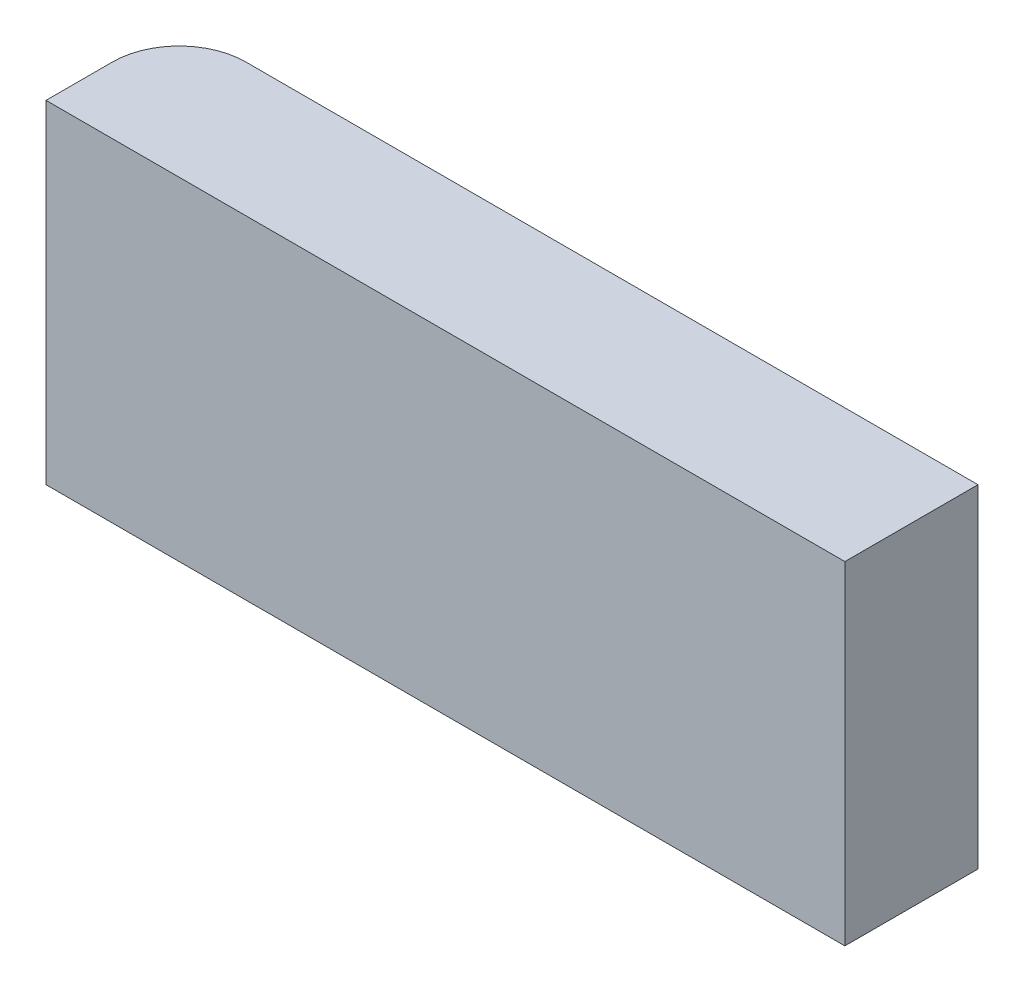
ISO-10303-21;
HEADER;
FILE_DESCRIPTION(('STEP AP214'),'2;1');
FILE_NAME('part.step','',(''),(''),'','','');
FILE_SCHEMA(('AUTOMOTIVE_DESIGN { 1 0 10303 214 1 1 1 1 }'));
ENDSEC;
DATA;
#1=APPLICATION_CONTEXT('core data for automotive mechanical design processes');
#2=APPLICATION_PROTOCOL_DEFINITION('international standard','automotive_design',2000,#1);
#3=PRODUCT_CONTEXT('',#1,'mechanical');
#4=PRODUCT('Part','Part','',(#3));
#5=PRODUCT_RELATED_PRODUCT_CATEGORY('part','',(#4));
#6=PRODUCT_DEFINITION_FORMATION('','',#4);
#7=PRODUCT_DEFINITION_CONTEXT('part definition',#1,'design');
#8=PRODUCT_DEFINITION('design','',#6,#7);
#9=PRODUCT_DEFINITION_SHAPE('','',#8);
#10=(LENGTH_UNIT() NAMED_UNIT(*) SI_UNIT(.MILLI.,.METRE.));
#11=(NAMED_UNIT(*) PLANE_ANGLE_UNIT() SI_UNIT($,.RADIAN.));
#12=(NAMED_UNIT(*) SI_UNIT($,.STERADIAN.) SOLID_ANGLE_UNIT());
#13=UNCERTAINTY_MEASURE_WITH_UNIT(LENGTH_MEASURE(1.E-05),#10,'distance_accuracy_value','');
#14=(GEOMETRIC_REPRESENTATION_CONTEXT(3) GLOBAL_UNCERTAINTY_ASSIGNED_CONTEXT((#13)) GLOBAL_UNIT_ASSIGNED_CONTEXT((#10,
#11,#12)) REPRESENTATION_CONTEXT('',''));
#15=CARTESIAN_POINT('',(0.,0.,0.));
#16=DIRECTION('',(0.,0.,1.));
#17=DIRECTION('',(1.,0.,0.));
#18=AXIS2_PLACEMENT_3D('',#15,#16,#17);
#19=CARTESIAN_POINT('',(0.5,-0.375,0.));
#20=DIRECTION('',(0.,0.,1.));
#21=DIRECTION('',(1.,0.,0.));
#22=AXIS2_PLACEMENT_3D('',#19,#20,#21);
#23=PLANE('',#22);
#24=DIRECTION('',(1.,0.,0.));
#25=VECTOR('',#24,1.);
#26=CARTESIAN_POINT('',(0.5,-0.375,0.));
#27=LINE('',#26,#25);
#28=CARTESIAN_POINT('',(2.3,-0.375,0.));
#29=VERTEX_POINT('',#28);
#30=CARTESIAN_POINT('',(0.65,-0.375,0.));
#31=VERTEX_POINT('',#30);
#32=EDGE_CURVE('E61',#29,#31,#27,.F.);
#33=ORIENTED_EDGE('',*,*,#32,.T.);
#34=DIRECTION('',(0.,1.,0.));
#35=VECTOR('',#34,1.);
#36=CARTESIAN_POINT('',(0.65,-0.375,0.));
#37=LINE('',#36,#35);
#38=CARTESIAN_POINT('',(0.65,0.375,0.));
#39=VERTEX_POINT('',#38);
#40=EDGE_CURVE('E71',#39,#31,#37,.F.);
#41=ORIENTED_EDGE('',*,*,#40,.F.);
#42=DIRECTION('',(1.,0.,0.));
#43=VECTOR('',#42,1.);
#44=CARTESIAN_POINT('',(0.5,0.375,0.));
#45=LINE('',#44,#43);
#46=CARTESIAN_POINT('',(2.3,0.375,0.));
#47=VERTEX_POINT('',#46);
#48=EDGE_CURVE('E108',#47,#39,#45,.F.);
#49=ORIENTED_EDGE('',*,*,#48,.F.);
#50=DIRECTION('',(0.,1.,0.));
#51=VECTOR('',#50,1.);
#52=CARTESIAN_POINT('',(2.3,-0.375,0.));
#53=LINE('',#52,#51);
#54=EDGE_CURVE('E89',#29,#47,#53,.T.);
#55=ORIENTED_EDGE('',*,*,#54,.F.);
#56=EDGE_LOOP('',(#33,#41,#49,#55));
#57=FACE_BOUND('',#56,.T.);
#58=ADVANCED_FACE('F17',(#57),#23,.F.);
#59=CARTESIAN_POINT('',(0.65,-0.375,0.15));
#60=DIRECTION('',(0.,1.,0.));
#61=DIRECTION('',(0.,0.,1.));
#62=AXIS2_PLACEMENT_3D('',#59,#60,#61);
#63=CYLINDRICAL_SURFACE('',#62,0.15);
#64=ORIENTED_EDGE('',*,*,#40,.T.);
#65=CARTESIAN_POINT('',(0.65,-0.375,0.15));
#66=DIRECTION('',(0.,1.,0.));
#67=DIRECTION('',(0.,0.,1.));
#68=AXIS2_PLACEMENT_3D('',#65,#66,#67);
#69=CIRCLE('',#68,0.15);
#70=CARTESIAN_POINT('',(0.5,-0.375,0.15));
#71=VERTEX_POINT('',#70);
#72=EDGE_CURVE('E20',#31,#71,#69,.T.);
#73=ORIENTED_EDGE('',*,*,#72,.T.);
#74=DIRECTION('',(0.,1.,0.));
#75=VECTOR('',#74,1.);
#76=CARTESIAN_POINT('',(0.5,-0.375,0.15));
#77=LINE('',#76,#75);
#78=CARTESIAN_POINT('',(0.5,0.375,0.15));
#79=VERTEX_POINT('',#78);
#80=EDGE_CURVE('E69',#71,#79,#77,.T.);
#81=ORIENTED_EDGE('',*,*,#80,.T.);
#82=CARTESIAN_POINT('',(0.65,0.375,0.15));
#83=DIRECTION('',(0.,1.,0.));
#84=DIRECTION('',(0.,0.,1.));
#85=AXIS2_PLACEMENT_3D('',#82,#83,#84);
#86=CIRCLE('',#85,0.15);
#87=EDGE_CURVE('E122',#39,#79,#86,.T.);
#88=ORIENTED_EDGE('',*,*,#87,.F.);
#89=EDGE_LOOP('',(#64,#73,#81,#88));
#90=FACE_BOUND('',#89,.T.);
#91=ADVANCED_FACE('F67',(#90),#63,.T.);
#92=CARTESIAN_POINT('',(0.5,-0.375,0.));
#93=DIRECTION('',(1.,0.,0.));
#94=DIRECTION('',(0.,0.,-1.));
#95=AXIS2_PLACEMENT_3D('',#92,#93,#94);
#96=PLANE('',#95);
#97=DIRECTION('',(0.,0.,1.));
#98=VECTOR('',#97,1.);
#99=CARTESIAN_POINT('',(0.5,0.375,0.));
#100=LINE('',#99,#98);
#101=CARTESIAN_POINT('',(0.5,0.375,0.3));
#102=VERTEX_POINT('',#101);
#103=EDGE_CURVE('E79',#79,#102,#100,.T.);
#104=ORIENTED_EDGE('',*,*,#103,.F.);
#105=ORIENTED_EDGE('',*,*,#80,.F.);
#106=DIRECTION('',(0.,0.,1.));
#107=VECTOR('',#106,1.);
#108=CARTESIAN_POINT('',(0.5,-0.375,0.));
#109=LINE('',#108,#107);
#110=CARTESIAN_POINT('',(0.5,-0.375,0.3));
#111=VERTEX_POINT('',#110);
#112=EDGE_CURVE('E74',#71,#111,#109,.T.);
#113=ORIENTED_EDGE('',*,*,#112,.T.);
#114=DIRECTION('',(0.,1.,0.));
#115=VECTOR('',#114,1.);
#116=CARTESIAN_POINT('',(0.5,-0.375,0.3));
#117=LINE('',#116,#115);
#118=EDGE_CURVE('E100',#102,#111,#117,.F.);
#119=ORIENTED_EDGE('',*,*,#118,.F.);
#120=EDGE_LOOP('',(#104,#105,#113,#119));
#121=FACE_BOUND('',#120,.T.);
#122=ADVANCED_FACE('F76',(#121),#96,.F.);
#123=CARTESIAN_POINT('',(0.5,-0.375,0.));
#124=DIRECTION('',(0.,1.,0.));
#125=DIRECTION('',(0.,0.,1.));
#126=AXIS2_PLACEMENT_3D('',#123,#124,#125);
#127=PLANE('',#126);
#128=DIRECTION('',(1.,0.,0.));
#129=VECTOR('',#128,1.);
#130=CARTESIAN_POINT('',(0.5,-0.375,0.3));
#131=LINE('',#130,#129);
#132=CARTESIAN_POINT('',(2.3,-0.375,0.3));
#133=VERTEX_POINT('',#132);
#134=EDGE_CURVE('E84',#111,#133,#131,.T.);
#135=ORIENTED_EDGE('',*,*,#134,.F.);
#136=ORIENTED_EDGE('',*,*,#112,.F.);
#137=ORIENTED_EDGE('',*,*,#72,.F.);
#138=ORIENTED_EDGE('',*,*,#32,.F.);
#139=DIRECTION('',(0.,0.,-1.));
#140=VECTOR('',#139,1.);
#141=CARTESIAN_POINT('',(2.3,-0.375,0.));
#142=LINE('',#141,#140);
#143=EDGE_CURVE('E86',#133,#29,#142,.T.);
#144=ORIENTED_EDGE('',*,*,#143,.F.);
#145=EDGE_LOOP('',(#135,#136,#137,#138,#144));
#146=FACE_BOUND('',#145,.T.);
#147=ADVANCED_FACE('F82',(#146),#127,.F.);
#148=CARTESIAN_POINT('',(2.3,-0.375,0.));
#149=DIRECTION('',(1.,0.,0.));
#150=DIRECTION('',(0.,0.,-1.));
#151=AXIS2_PLACEMENT_3D('',#148,#149,#150);
#152=PLANE('',#151);
#153=DIRECTION('',(0.,0.,1.));
#154=VECTOR('',#153,1.);
#155=CARTESIAN_POINT('',(2.3,0.375,0.));
#156=LINE('',#155,#154);
#157=CARTESIAN_POINT('',(2.3,0.375,0.3));
#158=VERTEX_POINT('',#157);
#159=EDGE_CURVE('E35',#158,#47,#156,.F.);
#160=ORIENTED_EDGE('',*,*,#159,.F.);
#161=DIRECTION('',(0.,1.,0.));
#162=VECTOR('',#161,1.);
#163=CARTESIAN_POINT('',(2.3,-0.375,0.3));
#164=LINE('',#163,#162);
#165=EDGE_CURVE('E26',#133,#158,#164,.T.);
#166=ORIENTED_EDGE('',*,*,#165,.F.);
#167=ORIENTED_EDGE('',*,*,#143,.T.);
#168=ORIENTED_EDGE('',*,*,#54,.T.);
#169=EDGE_LOOP('',(#160,#166,#167,#168));
#170=FACE_BOUND('',#169,.T.);
#171=ADVANCED_FACE('F129',(#170),#152,.T.);
#172=CARTESIAN_POINT('',(0.5,0.375,0.));
#173=DIRECTION('',(0.,1.,0.));
#174=DIRECTION('',(0.,0.,1.));
#175=AXIS2_PLACEMENT_3D('',#172,#173,#174);
#176=PLANE('',#175);
#177=DIRECTION('',(1.,0.,0.));
#178=VECTOR('',#177,1.);
#179=CARTESIAN_POINT('',(0.5,0.375,0.3));
#180=LINE('',#179,#178);
#181=EDGE_CURVE('E11',#158,#102,#180,.F.);
#182=ORIENTED_EDGE('',*,*,#181,.F.);
#183=ORIENTED_EDGE('',*,*,#159,.T.);
#184=ORIENTED_EDGE('',*,*,#48,.T.);
#185=ORIENTED_EDGE('',*,*,#87,.T.);
#186=ORIENTED_EDGE('',*,*,#103,.T.);
#187=EDGE_LOOP('',(#182,#183,#184,#185,#186));
#188=FACE_BOUND('',#187,.T.);
#189=ADVANCED_FACE('F128',(#188),#176,.T.);
#190=CARTESIAN_POINT('',(0.5,-0.375,0.3));
#191=DIRECTION('',(0.,0.,1.));
#192=DIRECTION('',(1.,0.,0.));
#193=AXIS2_PLACEMENT_3D('',#190,#191,#192);
#194=PLANE('',#193);
#195=ORIENTED_EDGE('',*,*,#165,.T.);
#196=ORIENTED_EDGE('',*,*,#181,.T.);
#197=ORIENTED_EDGE('',*,*,#118,.T.);
#198=ORIENTED_EDGE('',*,*,#134,.T.);
#199=EDGE_LOOP('',(#195,#196,#197,#198));
#200=FACE_BOUND('',#199,.T.);
#201=ADVANCED_FACE('F131',(#200),#194,.T.);
#202=CLOSED_SHELL('',(#58,#91,#122,#147,#171,#189,#201));
#203=MANIFOLD_SOLID_BREP('B1',#202);
#204=ADVANCED_BREP_SHAPE_REPRESENTATION('',(#18,#203),#14);
#205=SHAPE_DEFINITION_REPRESENTATION(#9,#204);
ENDSEC;
END-ISO-10303-21;
